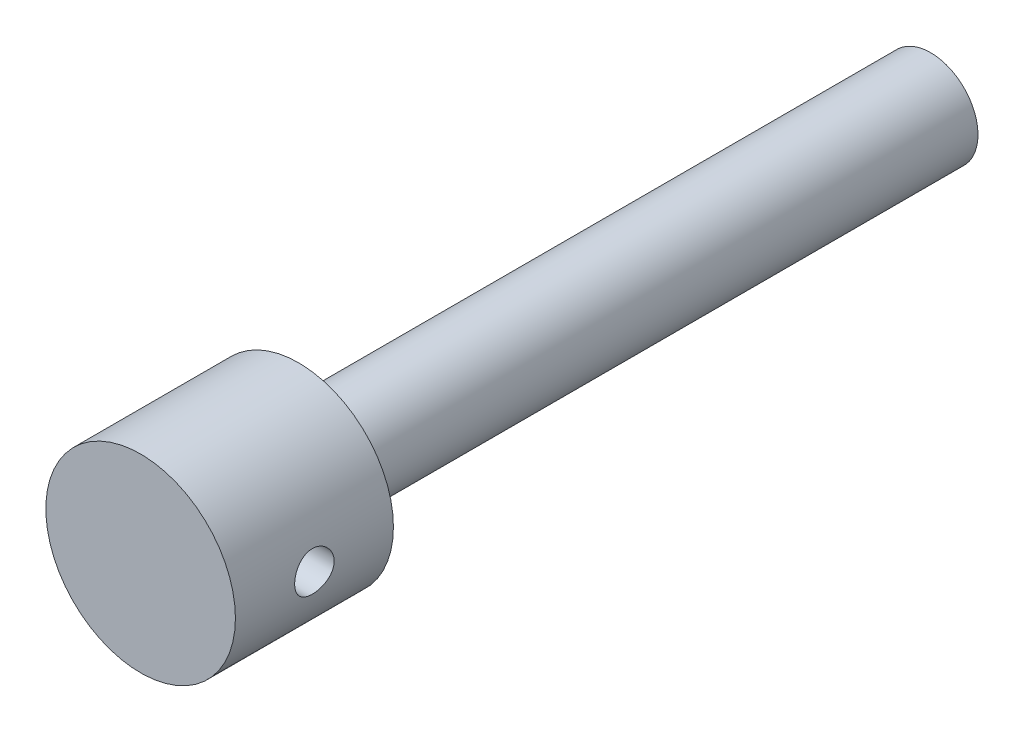
ISO-10303-21;
HEADER;
FILE_DESCRIPTION(('STEP AP214'),'2;1');
FILE_NAME('part.step','',(''),(''),'','','');
FILE_SCHEMA(('AUTOMOTIVE_DESIGN { 1 0 10303 214 1 1 1 1 }'));
ENDSEC;
DATA;
#1=APPLICATION_CONTEXT('core data for automotive mechanical design processes');
#2=APPLICATION_PROTOCOL_DEFINITION('international standard','automotive_design',2000,#1);
#3=PRODUCT_CONTEXT('',#1,'mechanical');
#4=PRODUCT('Part','Part','',(#3));
#5=PRODUCT_RELATED_PRODUCT_CATEGORY('part','',(#4));
#6=PRODUCT_DEFINITION_FORMATION('','',#4);
#7=PRODUCT_DEFINITION_CONTEXT('part definition',#1,'design');
#8=PRODUCT_DEFINITION('design','',#6,#7);
#9=PRODUCT_DEFINITION_SHAPE('','',#8);
#10=(LENGTH_UNIT() NAMED_UNIT(*) SI_UNIT(.MILLI.,.METRE.));
#11=(NAMED_UNIT(*) PLANE_ANGLE_UNIT() SI_UNIT($,.RADIAN.));
#12=(NAMED_UNIT(*) SI_UNIT($,.STERADIAN.) SOLID_ANGLE_UNIT());
#13=UNCERTAINTY_MEASURE_WITH_UNIT(LENGTH_MEASURE(1.E-05),#10,'distance_accuracy_value','');
#14=(GEOMETRIC_REPRESENTATION_CONTEXT(3) GLOBAL_UNCERTAINTY_ASSIGNED_CONTEXT((#13)) GLOBAL_UNIT_ASSIGNED_CONTEXT((#10,
#11,#12)) REPRESENTATION_CONTEXT('',''));
#15=CARTESIAN_POINT('',(0.,0.,0.));
#16=DIRECTION('',(0.,0.,1.));
#17=DIRECTION('',(1.,0.,0.));
#18=AXIS2_PLACEMENT_3D('',#15,#16,#17);
#19=CARTESIAN_POINT('',(0.,0.,80.));
#20=DIRECTION('',(0.,0.,-1.));
#21=DIRECTION('',(-1.,0.,0.));
#22=AXIS2_PLACEMENT_3D('',#19,#20,#21);
#23=CYLINDRICAL_SURFACE('',#22,6.);
#24=CARTESIAN_POINT('',(0.,0.,80.));
#25=DIRECTION('',(0.,0.,1.));
#26=DIRECTION('',(1.,0.,0.));
#27=AXIS2_PLACEMENT_3D('',#24,#25,#26);
#28=CIRCLE('',#27,6.);
#29=CARTESIAN_POINT('',(6.,0.,80.));
#30=VERTEX_POINT('',#29);
#31=EDGE_CURVE('E56',#30,#30,#28,.T.);
#32=ORIENTED_EDGE('',*,*,#31,.F.);
#33=EDGE_LOOP('',(#32));
#34=FACE_BOUND('',#33,.T.);
#35=CARTESIAN_POINT('',(0.,0.,0.));
#36=DIRECTION('',(0.,0.,1.));
#37=DIRECTION('',(1.,0.,0.));
#38=AXIS2_PLACEMENT_3D('',#35,#36,#37);
#39=CIRCLE('',#38,6.);
#40=CARTESIAN_POINT('',(6.,0.,0.));
#41=VERTEX_POINT('',#40);
#42=EDGE_CURVE('E60',#41,#41,#39,.T.);
#43=ORIENTED_EDGE('',*,*,#42,.T.);
#44=EDGE_LOOP('',(#43));
#45=FACE_BOUND('',#44,.T.);
#46=ADVANCED_FACE('F41',(#34,#45),#23,.T.);
#47=CARTESIAN_POINT('',(0.,0.,0.));
#48=DIRECTION('',(0.,0.,1.));
#49=DIRECTION('',(1.,0.,0.));
#50=AXIS2_PLACEMENT_3D('',#47,#48,#49);
#51=PLANE('',#50);
#52=ORIENTED_EDGE('',*,*,#42,.F.);
#53=EDGE_LOOP('',(#52));
#54=FACE_BOUND('',#53,.T.);
#55=ADVANCED_FACE('F86',(#54),#51,.F.);
#56=CARTESIAN_POINT('',(0.,0.,100.));
#57=DIRECTION('',(0.,0.,-1.));
#58=DIRECTION('',(-1.,0.,0.));
#59=AXIS2_PLACEMENT_3D('',#56,#57,#58);
#60=CYLINDRICAL_SURFACE('',#59,12.);
#61=CARTESIAN_POINT('',(12.,0.,92.5));
#62=CARTESIAN_POINT('',(11.999997430533,0.138818083403321,92.4999950450616));
#63=CARTESIAN_POINT('',(11.9975665755009,0.277697579041751,92.4883986685625));
#64=CARTESIAN_POINT('',(11.9881040198136,0.551522632533987,92.4423613009343));
#65=CARTESIAN_POINT('',(11.981068823785,0.686465120256626,92.4079029539261));
#66=CARTESIAN_POINT('',(11.963182183924,0.948418264582686,92.3172590901564));
#67=CARTESIAN_POINT('',(11.9523345410529,1.07543667341837,92.2610952080022));
#68=CARTESIAN_POINT('',(11.9279985561972,1.31824065721192,92.1287007822876));
#69=CARTESIAN_POINT('',(11.9145103325195,1.43402673506865,92.0524711376883));
#70=CARTESIAN_POINT('',(11.886154000493,1.65278064861767,91.8809273196187));
#71=CARTESIAN_POINT('',(11.8712701169706,1.75556048832536,91.7853759975299));
#72=CARTESIAN_POINT('',(11.841913153849,1.94375555353878,91.5784106816098));
#73=CARTESIAN_POINT('',(11.8274401083337,2.02916934192197,91.4669953762555));
#74=CARTESIAN_POINT('',(11.8003888519062,2.18102063354433,91.2300960624677));
#75=CARTESIAN_POINT('',(11.7878309034966,2.24726109361301,91.1044832309945));
#76=CARTESIAN_POINT('',(11.7662568130004,2.35762238696127,90.8436050964545));
#77=CARTESIAN_POINT('',(11.7572402893514,2.40174560335282,90.708340835115));
#78=CARTESIAN_POINT('',(11.7439300197225,2.46600480267473,90.4340295251687));
#79=CARTESIAN_POINT('',(11.7395711371173,2.48647195393597,90.2950632813305));
#80=CARTESIAN_POINT('',(11.7358738143298,2.50386715311229,90.0156063142747));
#81=CARTESIAN_POINT('',(11.7365348160196,2.50079781789373,89.8751157622694));
#82=CARTESIAN_POINT('',(11.7427434863835,2.47147438074394,89.5990379440497));
#83=CARTESIAN_POINT('',(11.748210673598,2.4456021046544,89.4634080406776));
#84=CARTESIAN_POINT('',(11.7632887523188,2.3720108705989,89.1984569807102));
#85=CARTESIAN_POINT('',(11.7728998568263,2.32429078962763,89.0691361487874));
#86=CARTESIAN_POINT('',(11.795263829282,2.20800006427857,88.8193855431681));
#87=CARTESIAN_POINT('',(11.8080390757117,2.13928005068474,88.6990274069459));
#88=CARTESIAN_POINT('',(11.8352778002144,1.98304539854963,88.4714085114637));
#89=CARTESIAN_POINT('',(11.8497414879707,1.89552842452517,88.3641493823281));
#90=CARTESIAN_POINT('',(11.8790746185982,1.70214984309356,88.1635720778393));
#91=CARTESIAN_POINT('',(11.8939464639895,1.59596286682416,88.070567662206));
#92=CARTESIAN_POINT('',(11.92216176286,1.36933457722359,87.9036391155421));
#93=CARTESIAN_POINT('',(11.9355051934047,1.24889305005152,87.8297152708032));
#94=CARTESIAN_POINT('',(11.9591974188563,0.996811082470946,87.7029798369281));
#95=CARTESIAN_POINT('',(11.9695407942052,0.865150923852988,87.6502063908658));
#96=CARTESIAN_POINT('',(11.9860267642256,0.594569241944299,87.567616590329));
#97=CARTESIAN_POINT('',(11.9921699119211,0.455648677190171,87.5377972135372));
#98=CARTESIAN_POINT('',(11.9994855043091,0.177183731401666,87.5024114958642));
#99=CARTESIAN_POINT('',(12.0007458707516,0.0376961110523537,87.4964161170115));
#100=CARTESIAN_POINT('',(11.9983990450555,-0.240287597515431,87.5076898999382));
#101=CARTESIAN_POINT('',(11.9947921509631,-0.378783745924517,87.5249576372032));
#102=CARTESIAN_POINT('',(11.9831712995837,-0.649452734239626,87.5819113069391));
#103=CARTESIAN_POINT('',(11.9752010573615,-0.781674385788411,87.621374970767));
#104=CARTESIAN_POINT('',(11.9557445448479,-1.03762289332266,87.7213557208428));
#105=CARTESIAN_POINT('',(11.9442579948916,-1.16134907267355,87.781874481732));
#106=CARTESIAN_POINT('',(11.9188248298143,-1.39858861388699,87.9231607564751));
#107=CARTESIAN_POINT('',(11.9048478762466,-1.51194643893966,88.0041838591381));
#108=CARTESIAN_POINT('',(11.8760513659942,-1.72361089177303,88.1838391261525));
#109=CARTESIAN_POINT('',(11.8612317108502,-1.82191575582657,88.2824733510379));
#110=CARTESIAN_POINT('',(11.8321204906275,-2.00235729730359,88.4965111539994));
#111=CARTESIAN_POINT('',(11.81784178615,-2.08419829200408,88.6121660639106));
#112=CARTESIAN_POINT('',(11.7917120203161,-2.22729438158486,88.8558325684276));
#113=CARTESIAN_POINT('',(11.779860857893,-2.28855033355728,88.9838436482782));
#114=CARTESIAN_POINT('',(11.7600340141608,-2.38834492887844,89.2479223925965));
#115=CARTESIAN_POINT('',(11.7520374556937,-2.42700619656063,89.3839420743317));
#116=CARTESIAN_POINT('',(11.7407836941939,-2.48088077046814,89.6607331009845));
#117=CARTESIAN_POINT('',(11.7375258132073,-2.49609743088881,89.8015037632389));
#118=CARTESIAN_POINT('',(11.7361581461701,-2.50251852975222,90.0808268019993));
#119=CARTESIAN_POINT('',(11.73794804643,-2.4941908524545,90.2193681404441));
#120=CARTESIAN_POINT('',(11.7462489450986,-2.45479810628063,90.4930280178405));
#121=CARTESIAN_POINT('',(11.7527598981925,-2.42373325564532,90.6281465896322));
#122=CARTESIAN_POINT('',(11.7697226489543,-2.33996435537169,90.8907955437813));
#123=CARTESIAN_POINT('',(11.7801631401586,-2.28732235136841,91.0183464929739));
#124=CARTESIAN_POINT('',(11.8038141147748,-2.16194914599513,91.2628775520534));
#125=CARTESIAN_POINT('',(11.8170248553092,-2.08921607966059,91.3798566792663));
#126=CARTESIAN_POINT('',(11.8450315910229,-1.92414739068482,91.6022432541589));
#127=CARTESIAN_POINT('',(11.8598522773681,-1.83147578083645,91.70739824913));
#128=CARTESIAN_POINT('',(11.8892367916643,-1.62984887623066,91.9008189864527));
#129=CARTESIAN_POINT('',(11.9038005596976,-1.52088983766593,91.989080835103));
#130=CARTESIAN_POINT('',(11.9312288909528,-1.28826885501541,92.1471771463681));
#131=CARTESIAN_POINT('',(11.9440719214649,-1.1644518430427,92.2167873597726));
#132=CARTESIAN_POINT('',(11.9663981698818,-0.906639687996903,92.3341004568601));
#133=CARTESIAN_POINT('',(11.975884323642,-0.772653563814482,92.3818224943637));
#134=CARTESIAN_POINT('',(11.9886499956289,-0.532030585800204,92.4450805565769));
#135=CARTESIAN_POINT('',(11.9928807132279,-0.426735187455853,92.4656375264177));
#136=CARTESIAN_POINT('',(11.9985566557952,-0.214305348353071,92.4930989085547));
#137=CARTESIAN_POINT('',(12.0000019836917,-0.107170975697742,92.5000038253344));
#138=CARTESIAN_POINT('',(12.,0.,92.5));
#139=B_SPLINE_CURVE_WITH_KNOTS('',3,(#61,#62,#63,#64,#65,#66,#67,#68,#69,#70,#71,#72,#73,#74,
#75,#76,#77,#78,#79,#80,#81,#82,#83,#84,#85,#86,#87,#88,#89,#90,#91,#92,#93,#94,#95,#96,#97,#98,
#99,#100,#101,#102,#103,#104,#105,#106,#107,#108,#109,#110,#111,#112,#113,#114,#115,#116,#117,
#118,#119,#120,#121,#122,#123,#124,#125,#126,#127,#128,#129,#130,#131,#132,#133,#134,#135,#136,
#137,#138),.UNSPECIFIED.,.T.,.F.,(4,2,2,2,2,2,2,2,2,2,2,2,2,2,2,2,2,2,2,2,2,2,2,2,2,2,2,2,2,2,2,
2,2,2,2,2,2,2,4),(0.,0.416062090206366,0.832440399812449,1.2484047576509,1.66435048314598,
2.08575052776244,2.50718543103571,2.93280898357096,3.3583866657098,3.77793150339708,
4.19742969534329,4.61003424258117,5.02266000060558,5.43829184833498,5.85397536736068,
6.27779052710931,6.70161204556436,7.12619448999325,7.55072102091542,7.9675667881535,
8.38438703104554,8.79710573265242,9.20985726781865,9.62803167991471,10.0462550512915,
10.4714252765867,10.8965777970262,11.3194010019005,11.7421637082837,12.1565844658208,
12.5710012456272,12.9842346278651,13.3975063816296,13.8183804966062,14.2393515023474,
14.6651772879651,15.0906297292994,15.4118517695456,15.7330619394678),.UNSPECIFIED.);
#140=CARTESIAN_POINT('',(12.,0.,92.5));
#141=VERTEX_POINT('',#140);
#142=EDGE_CURVE('E10',#141,#141,#139,.T.);
#143=ORIENTED_EDGE('',*,*,#142,.T.);
#144=EDGE_LOOP('',(#143));
#145=FACE_BOUND('',#144,.T.);
#146=CARTESIAN_POINT('',(-12.,0.,92.5));
#147=CARTESIAN_POINT('',(-11.999997430533,-0.138818083403322,92.4999950450616));
#148=CARTESIAN_POINT('',(-11.9975665755009,-0.277697579041751,92.4883986685625));
#149=CARTESIAN_POINT('',(-11.9881040198136,-0.551522632533988,92.4423613009343));
#150=CARTESIAN_POINT('',(-11.981068823785,-0.686465120256627,92.4079029539261));
#151=CARTESIAN_POINT('',(-11.963182183924,-0.948418264582687,92.3172590901564));
#152=CARTESIAN_POINT('',(-11.9523345410529,-1.07543667341837,92.2610952080022));
#153=CARTESIAN_POINT('',(-11.9279985561972,-1.31824065721192,92.1287007822876));
#154=CARTESIAN_POINT('',(-11.9145103325195,-1.43402673506866,92.0524711376883));
#155=CARTESIAN_POINT('',(-11.886154000493,-1.65278064861767,91.8809273196187));
#156=CARTESIAN_POINT('',(-11.8712701169706,-1.75556048832537,91.7853759975298));
#157=CARTESIAN_POINT('',(-11.841913153849,-1.94375555353878,91.5784106816098));
#158=CARTESIAN_POINT('',(-11.8274401083337,-2.02916934192197,91.4669953762555));
#159=CARTESIAN_POINT('',(-11.8003888519062,-2.18102063354434,91.2300960624677));
#160=CARTESIAN_POINT('',(-11.7878309034966,-2.24726109361302,91.1044832309945));
#161=CARTESIAN_POINT('',(-11.7662568130004,-2.35762238696127,90.8436050964545));
#162=CARTESIAN_POINT('',(-11.7572402893514,-2.40174560335282,90.7083408351149));
#163=CARTESIAN_POINT('',(-11.7439300197225,-2.46600480267473,90.4340295251687));
#164=CARTESIAN_POINT('',(-11.7395711371173,-2.48647195393597,90.2950632813305));
#165=CARTESIAN_POINT('',(-11.7358738143298,-2.50386715311229,90.0156063142747));
#166=CARTESIAN_POINT('',(-11.7365348160196,-2.50079781789373,89.8751157622694));
#167=CARTESIAN_POINT('',(-11.7427434863835,-2.47147438074394,89.5990379440497));
#168=CARTESIAN_POINT('',(-11.748210673598,-2.4456021046544,89.4634080406776));
#169=CARTESIAN_POINT('',(-11.7632887523188,-2.3720108705989,89.1984569807102));
#170=CARTESIAN_POINT('',(-11.7728998568263,-2.32429078962763,89.0691361487874));
#171=CARTESIAN_POINT('',(-11.795263829282,-2.20800006427857,88.8193855431681));
#172=CARTESIAN_POINT('',(-11.8080390757117,-2.13928005068474,88.6990274069459));
#173=CARTESIAN_POINT('',(-11.8352778002144,-1.98304539854963,88.4714085114637));
#174=CARTESIAN_POINT('',(-11.8497414879707,-1.89552842452517,88.3641493823281));
#175=CARTESIAN_POINT('',(-11.8790746185982,-1.70214984309356,88.1635720778393));
#176=CARTESIAN_POINT('',(-11.8939464639895,-1.59596286682416,88.070567662206));
#177=CARTESIAN_POINT('',(-11.92216176286,-1.36933457722359,87.9036391155421));
#178=CARTESIAN_POINT('',(-11.9355051934047,-1.24889305005152,87.8297152708032));
#179=CARTESIAN_POINT('',(-11.9591974188563,-0.996811082470946,87.7029798369281));
#180=CARTESIAN_POINT('',(-11.9695407942052,-0.865150923852987,87.6502063908658));
#181=CARTESIAN_POINT('',(-11.9860267642256,-0.594569241944298,87.567616590329));
#182=CARTESIAN_POINT('',(-11.9921699119211,-0.45564867719017,87.5377972135372));
#183=CARTESIAN_POINT('',(-11.9994855043091,-0.177183731401665,87.5024114958642));
#184=CARTESIAN_POINT('',(-12.0007458707516,-0.0376961110523519,87.4964161170115));
#185=CARTESIAN_POINT('',(-11.9983990450555,0.240287597515433,87.5076898999382));
#186=CARTESIAN_POINT('',(-11.9947921509631,0.378783745924518,87.5249576372032));
#187=CARTESIAN_POINT('',(-11.9831712995837,0.64945273423963,87.5819113069391));
#188=CARTESIAN_POINT('',(-11.9752010573615,0.781674385788419,87.621374970767));
#189=CARTESIAN_POINT('',(-11.9557445448479,1.03762289332267,87.7213557208428));
#190=CARTESIAN_POINT('',(-11.9442579948916,1.16134907267355,87.781874481732));
#191=CARTESIAN_POINT('',(-11.9188248298143,1.39858861388699,87.9231607564751));
#192=CARTESIAN_POINT('',(-11.9048478762466,1.51194643893967,88.0041838591381));
#193=CARTESIAN_POINT('',(-11.8760513659942,1.72361089177304,88.1838391261525));
#194=CARTESIAN_POINT('',(-11.8612317108502,1.82191575582657,88.2824733510379));
#195=CARTESIAN_POINT('',(-11.8321204906275,2.0023572973036,88.4965111539994));
#196=CARTESIAN_POINT('',(-11.81784178615,2.08419829200409,88.6121660639106));
#197=CARTESIAN_POINT('',(-11.7917120203161,2.22729438158487,88.8558325684276));
#198=CARTESIAN_POINT('',(-11.779860857893,2.28855033355728,88.9838436482782));
#199=CARTESIAN_POINT('',(-11.7600340141608,2.38834492887844,89.2479223925965));
#200=CARTESIAN_POINT('',(-11.7520374556937,2.42700619656063,89.3839420743317));
#201=CARTESIAN_POINT('',(-11.7407836941939,2.48088077046814,89.6607331009845));
#202=CARTESIAN_POINT('',(-11.7375258132073,2.49609743088881,89.8015037632389));
#203=CARTESIAN_POINT('',(-11.7361581461701,2.50251852975222,90.0808268019993));
#204=CARTESIAN_POINT('',(-11.73794804643,2.4941908524545,90.2193681404441));
#205=CARTESIAN_POINT('',(-11.7462489450986,2.45479810628063,90.4930280178405));
#206=CARTESIAN_POINT('',(-11.7527598981925,2.42373325564532,90.6281465896322));
#207=CARTESIAN_POINT('',(-11.7697226489543,2.33996435537169,90.8907955437813));
#208=CARTESIAN_POINT('',(-11.7801631401586,2.28732235136841,91.0183464929739));
#209=CARTESIAN_POINT('',(-11.8038141147748,2.16194914599513,91.2628775520534));
#210=CARTESIAN_POINT('',(-11.8170248553092,2.08921607966059,91.3798566792663));
#211=CARTESIAN_POINT('',(-11.8450315910229,1.92414739068482,91.6022432541589));
#212=CARTESIAN_POINT('',(-11.8598522773681,1.83147578083645,91.70739824913));
#213=CARTESIAN_POINT('',(-11.8892367916643,1.62984887623066,91.9008189864527));
#214=CARTESIAN_POINT('',(-11.9038005596976,1.52088983766593,91.989080835103));
#215=CARTESIAN_POINT('',(-11.9312288909528,1.28826885501541,92.1471771463681));
#216=CARTESIAN_POINT('',(-11.9440719214649,1.1644518430427,92.2167873597726));
#217=CARTESIAN_POINT('',(-11.9663981698818,0.906639687996903,92.3341004568601));
#218=CARTESIAN_POINT('',(-11.975884323642,0.772653563814481,92.3818224943637));
#219=CARTESIAN_POINT('',(-11.9886499956289,0.532030585800204,92.4450805565769));
#220=CARTESIAN_POINT('',(-11.9928807132279,0.426735187455853,92.4656375264177));
#221=CARTESIAN_POINT('',(-11.9985566557952,0.214305348353072,92.4930989085547));
#222=CARTESIAN_POINT('',(-12.0000019836917,0.107170975697742,92.5000038253344));
#223=CARTESIAN_POINT('',(-12.,0.,92.5));
#224=B_SPLINE_CURVE_WITH_KNOTS('',3,(#146,#147,#148,#149,#150,#151,#152,#153,#154,#155,#156,
#157,#158,#159,#160,#161,#162,#163,#164,#165,#166,#167,#168,#169,#170,#171,#172,#173,#174,#175,
#176,#177,#178,#179,#180,#181,#182,#183,#184,#185,#186,#187,#188,#189,#190,#191,#192,#193,#194,
#195,#196,#197,#198,#199,#200,#201,#202,#203,#204,#205,#206,#207,#208,#209,#210,#211,#212,#213,
#214,#215,#216,#217,#218,#219,#220,#221,#222,#223),.UNSPECIFIED.,.T.,.F.,(4,2,2,2,2,2,2,2,2,2,2,
2,2,2,2,2,2,2,2,2,2,2,2,2,2,2,2,2,2,2,2,2,2,2,2,2,2,2,4),(0.,0.416062090206366,0.83244039981245,
1.2484047576509,1.66435048314598,2.08575052776245,2.50718543103571,2.93280898357098,
3.3583866657098,3.77793150339708,4.19742969534329,4.61003424258117,5.02266000060558,
5.43829184833498,5.85397536736068,6.27779052710931,6.70161204556436,7.12619448999325,
7.55072102091542,7.9675667881535,8.38438703104554,8.79710573265243,9.20985726781865,
9.62803167991471,10.0462550512915,10.4714252765867,10.8965777970262,11.3194010019005,
11.7421637082837,12.1565844658208,12.5710012456272,12.9842346278651,13.3975063816296,
13.8183804966062,14.2393515023474,14.6651772879651,15.0906297292995,15.4118517695456,
15.7330619394678),.UNSPECIFIED.);
#225=CARTESIAN_POINT('',(-12.,0.,92.5));
#226=VERTEX_POINT('',#225);
#227=EDGE_CURVE('E52',#226,#226,#224,.T.);
#228=ORIENTED_EDGE('',*,*,#227,.T.);
#229=EDGE_LOOP('',(#228));
#230=FACE_BOUND('',#229,.T.);
#231=CARTESIAN_POINT('',(0.,0.,100.));
#232=DIRECTION('',(0.,0.,1.));
#233=DIRECTION('',(1.,0.,0.));
#234=AXIS2_PLACEMENT_3D('',#231,#232,#233);
#235=CIRCLE('',#234,12.);
#236=CARTESIAN_POINT('',(12.,0.,100.));
#237=VERTEX_POINT('',#236);
#238=EDGE_CURVE('E96',#237,#237,#235,.T.);
#239=ORIENTED_EDGE('',*,*,#238,.F.);
#240=EDGE_LOOP('',(#239));
#241=FACE_BOUND('',#240,.T.);
#242=CARTESIAN_POINT('',(0.,0.,80.));
#243=DIRECTION('',(0.,0.,1.));
#244=DIRECTION('',(1.,0.,0.));
#245=AXIS2_PLACEMENT_3D('',#242,#243,#244);
#246=CIRCLE('',#245,12.);
#247=CARTESIAN_POINT('',(12.,0.,80.));
#248=VERTEX_POINT('',#247);
#249=EDGE_CURVE('E98',#248,#248,#246,.T.);
#250=ORIENTED_EDGE('',*,*,#249,.T.);
#251=EDGE_LOOP('',(#250));
#252=FACE_BOUND('',#251,.T.);
#253=ADVANCED_FACE('F66',(#145,#230,#241,#252),#60,.T.);
#254=CARTESIAN_POINT('',(0.,0.,100.));
#255=DIRECTION('',(0.,0.,1.));
#256=DIRECTION('',(1.,0.,0.));
#257=AXIS2_PLACEMENT_3D('',#254,#255,#256);
#258=PLANE('',#257);
#259=ORIENTED_EDGE('',*,*,#238,.T.);
#260=EDGE_LOOP('',(#259));
#261=FACE_BOUND('',#260,.T.);
#262=ADVANCED_FACE('F75',(#261),#258,.T.);
#263=CARTESIAN_POINT('',(0.,0.,80.));
#264=DIRECTION('',(0.,0.,1.));
#265=DIRECTION('',(1.,0.,0.));
#266=AXIS2_PLACEMENT_3D('',#263,#264,#265);
#267=PLANE('',#266);
#268=ORIENTED_EDGE('',*,*,#31,.T.);
#269=EDGE_LOOP('',(#268));
#270=FACE_BOUND('',#269,.T.);
#271=ORIENTED_EDGE('',*,*,#249,.F.);
#272=EDGE_LOOP('',(#271));
#273=FACE_BOUND('',#272,.T.);
#274=ADVANCED_FACE('F73',(#270,#273),#267,.F.);
#275=CARTESIAN_POINT('',(12.,0.,90.));
#276=DIRECTION('',(-1.,0.,0.));
#277=DIRECTION('',(0.,0.,1.));
#278=AXIS2_PLACEMENT_3D('',#275,#276,#277);
#279=CYLINDRICAL_SURFACE('',#278,2.49999999999999);
#280=ORIENTED_EDGE('',*,*,#227,.F.);
#281=EDGE_LOOP('',(#280));
#282=FACE_BOUND('',#281,.T.);
#283=ORIENTED_EDGE('',*,*,#142,.F.);
#284=EDGE_LOOP('',(#283));
#285=FACE_BOUND('',#284,.T.);
#286=ADVANCED_FACE('F69',(#282,#285),#279,.F.);
#287=CLOSED_SHELL('',(#46,#55,#253,#262,#274,#286));
#288=MANIFOLD_SOLID_BREP('B2',#287);
#289=ADVANCED_BREP_SHAPE_REPRESENTATION('',(#18,#288),#14);
#290=SHAPE_DEFINITION_REPRESENTATION(#9,#289);
ENDSEC;
END-ISO-10303-21;
